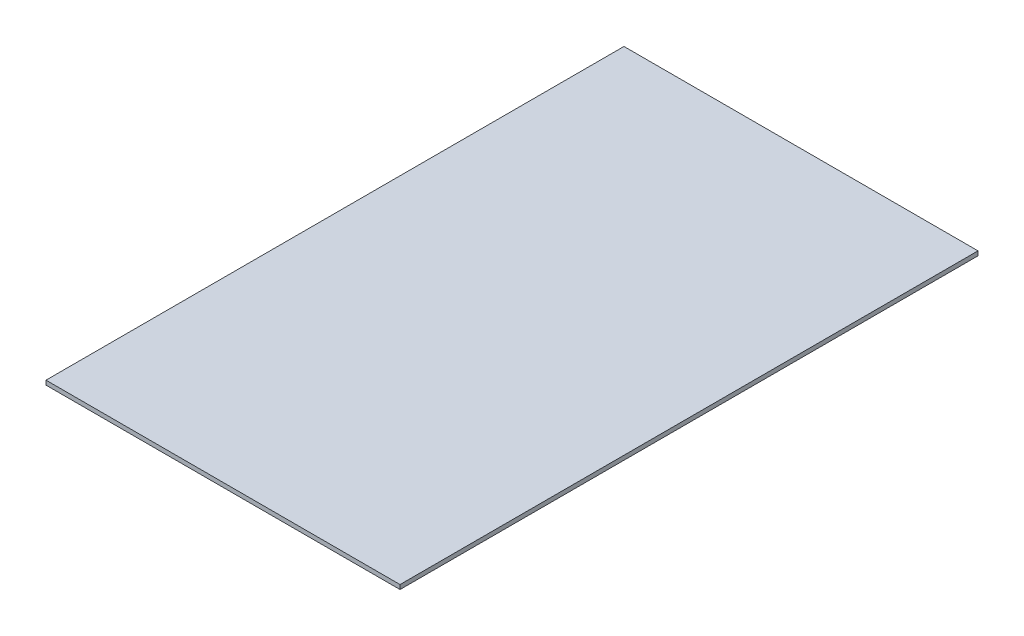
ISO-10303-21;
HEADER;
FILE_DESCRIPTION(('STEP AP214'),'2;1');
FILE_NAME('part.step','',(''),(''),'','','');
FILE_SCHEMA(('AUTOMOTIVE_DESIGN { 1 0 10303 214 1 1 1 1 }'));
ENDSEC;
DATA;
#1=APPLICATION_CONTEXT('core data for automotive mechanical design processes');
#2=APPLICATION_PROTOCOL_DEFINITION('international standard','automotive_design',2000,#1);
#3=PRODUCT_CONTEXT('',#1,'mechanical');
#4=PRODUCT('Part','Part','',(#3));
#5=PRODUCT_RELATED_PRODUCT_CATEGORY('part','',(#4));
#6=PRODUCT_DEFINITION_FORMATION('','',#4);
#7=PRODUCT_DEFINITION_CONTEXT('part definition',#1,'design');
#8=PRODUCT_DEFINITION('design','',#6,#7);
#9=PRODUCT_DEFINITION_SHAPE('','',#8);
#10=(LENGTH_UNIT() NAMED_UNIT(*) SI_UNIT(.MILLI.,.METRE.));
#11=(NAMED_UNIT(*) PLANE_ANGLE_UNIT() SI_UNIT($,.RADIAN.));
#12=(NAMED_UNIT(*) SI_UNIT($,.STERADIAN.) SOLID_ANGLE_UNIT());
#13=UNCERTAINTY_MEASURE_WITH_UNIT(LENGTH_MEASURE(1.E-05),#10,'distance_accuracy_value','');
#14=(GEOMETRIC_REPRESENTATION_CONTEXT(3) GLOBAL_UNCERTAINTY_ASSIGNED_CONTEXT((#13)) GLOBAL_UNIT_ASSIGNED_CONTEXT((#10,
#11,#12)) REPRESENTATION_CONTEXT('',''));
#15=CARTESIAN_POINT('',(0.,0.,0.));
#16=DIRECTION('',(0.,0.,1.));
#17=DIRECTION('',(1.,0.,0.));
#18=AXIS2_PLACEMENT_3D('',#15,#16,#17);
#19=CARTESIAN_POINT('',(0.,3.,0.));
#20=DIRECTION('',(1.,0.,0.));
#21=DIRECTION('',(0.,0.,-1.));
#22=AXIS2_PLACEMENT_3D('',#19,#20,#21);
#23=PLANE('',#22);
#24=DIRECTION('',(0.,0.,1.));
#25=VECTOR('',#24,1.);
#26=CARTESIAN_POINT('',(0.,0.,0.));
#27=LINE('',#26,#25);
#28=CARTESIAN_POINT('',(0.,0.,-400.));
#29=VERTEX_POINT('',#28);
#30=CARTESIAN_POINT('',(0.,0.,0.));
#31=VERTEX_POINT('',#30);
#32=EDGE_CURVE('E99',#29,#31,#27,.T.);
#33=ORIENTED_EDGE('',*,*,#32,.T.);
#34=DIRECTION('',(0.,-1.,0.));
#35=VECTOR('',#34,1.);
#36=CARTESIAN_POINT('',(0.,3.,0.));
#37=LINE('',#36,#35);
#38=CARTESIAN_POINT('',(0.,3.,0.));
#39=VERTEX_POINT('',#38);
#40=EDGE_CURVE('E11',#39,#31,#37,.T.);
#41=ORIENTED_EDGE('',*,*,#40,.F.);
#42=DIRECTION('',(0.,0.,1.));
#43=VECTOR('',#42,1.);
#44=CARTESIAN_POINT('',(0.,3.,0.));
#45=LINE('',#44,#43);
#46=CARTESIAN_POINT('',(0.,3.,-400.));
#47=VERTEX_POINT('',#46);
#48=EDGE_CURVE('E87',#47,#39,#45,.T.);
#49=ORIENTED_EDGE('',*,*,#48,.F.);
#50=DIRECTION('',(0.,-1.,0.));
#51=VECTOR('',#50,1.);
#52=CARTESIAN_POINT('',(0.,3.,-400.));
#53=LINE('',#52,#51);
#54=EDGE_CURVE('E95',#47,#29,#53,.T.);
#55=ORIENTED_EDGE('',*,*,#54,.T.);
#56=EDGE_LOOP('',(#33,#41,#49,#55));
#57=FACE_BOUND('',#56,.T.);
#58=ADVANCED_FACE('F36',(#57),#23,.F.);
#59=CARTESIAN_POINT('',(0.,3.,0.));
#60=DIRECTION('',(0.,0.,-1.));
#61=DIRECTION('',(-1.,0.,0.));
#62=AXIS2_PLACEMENT_3D('',#59,#60,#61);
#63=PLANE('',#62);
#64=DIRECTION('',(1.,0.,0.));
#65=VECTOR('',#64,1.);
#66=CARTESIAN_POINT('',(0.,0.,0.));
#67=LINE('',#66,#65);
#68=CARTESIAN_POINT('',(245.,0.,0.));
#69=VERTEX_POINT('',#68);
#70=EDGE_CURVE('E91',#31,#69,#67,.T.);
#71=ORIENTED_EDGE('',*,*,#70,.T.);
#72=DIRECTION('',(0.,-1.,0.));
#73=VECTOR('',#72,1.);
#74=CARTESIAN_POINT('',(245.,3.,0.));
#75=LINE('',#74,#73);
#76=CARTESIAN_POINT('',(245.,3.,0.));
#77=VERTEX_POINT('',#76);
#78=EDGE_CURVE('E44',#77,#69,#75,.T.);
#79=ORIENTED_EDGE('',*,*,#78,.F.);
#80=DIRECTION('',(1.,0.,0.));
#81=VECTOR('',#80,1.);
#82=CARTESIAN_POINT('',(0.,3.,0.));
#83=LINE('',#82,#81);
#84=EDGE_CURVE('E82',#39,#77,#83,.T.);
#85=ORIENTED_EDGE('',*,*,#84,.F.);
#86=ORIENTED_EDGE('',*,*,#40,.T.);
#87=EDGE_LOOP('',(#71,#79,#85,#86));
#88=FACE_BOUND('',#87,.T.);
#89=ADVANCED_FACE('F90',(#88),#63,.F.);
#90=CARTESIAN_POINT('',(245.,3.,0.));
#91=DIRECTION('',(-1.,0.,0.));
#92=DIRECTION('',(0.,0.,1.));
#93=AXIS2_PLACEMENT_3D('',#90,#91,#92);
#94=PLANE('',#93);
#95=DIRECTION('',(0.,0.,-1.));
#96=VECTOR('',#95,1.);
#97=CARTESIAN_POINT('',(245.,0.,0.));
#98=LINE('',#97,#96);
#99=CARTESIAN_POINT('',(245.,0.,-400.));
#100=VERTEX_POINT('',#99);
#101=EDGE_CURVE('E69',#69,#100,#98,.T.);
#102=ORIENTED_EDGE('',*,*,#101,.T.);
#103=DIRECTION('',(0.,-1.,0.));
#104=VECTOR('',#103,1.);
#105=CARTESIAN_POINT('',(245.,3.,-400.));
#106=LINE('',#105,#104);
#107=CARTESIAN_POINT('',(245.,3.,-400.));
#108=VERTEX_POINT('',#107);
#109=EDGE_CURVE('E92',#108,#100,#106,.T.);
#110=ORIENTED_EDGE('',*,*,#109,.F.);
#111=DIRECTION('',(0.,0.,-1.));
#112=VECTOR('',#111,1.);
#113=CARTESIAN_POINT('',(245.,3.,0.));
#114=LINE('',#113,#112);
#115=EDGE_CURVE('E85',#77,#108,#114,.T.);
#116=ORIENTED_EDGE('',*,*,#115,.F.);
#117=ORIENTED_EDGE('',*,*,#78,.T.);
#118=EDGE_LOOP('',(#102,#110,#116,#117));
#119=FACE_BOUND('',#118,.T.);
#120=ADVANCED_FACE('F93',(#119),#94,.F.);
#121=CARTESIAN_POINT('',(0.,3.,-400.));
#122=DIRECTION('',(0.,0.,1.));
#123=DIRECTION('',(1.,0.,0.));
#124=AXIS2_PLACEMENT_3D('',#121,#122,#123);
#125=PLANE('',#124);
#126=DIRECTION('',(-1.,0.,0.));
#127=VECTOR('',#126,1.);
#128=CARTESIAN_POINT('',(0.,0.,-400.));
#129=LINE('',#128,#127);
#130=EDGE_CURVE('E75',#100,#29,#129,.T.);
#131=ORIENTED_EDGE('',*,*,#130,.T.);
#132=ORIENTED_EDGE('',*,*,#54,.F.);
#133=DIRECTION('',(-1.,0.,0.));
#134=VECTOR('',#133,1.);
#135=CARTESIAN_POINT('',(0.,3.,-400.));
#136=LINE('',#135,#134);
#137=EDGE_CURVE('E52',#108,#47,#136,.T.);
#138=ORIENTED_EDGE('',*,*,#137,.F.);
#139=ORIENTED_EDGE('',*,*,#109,.T.);
#140=EDGE_LOOP('',(#131,#132,#138,#139));
#141=FACE_BOUND('',#140,.T.);
#142=ADVANCED_FACE('F106',(#141),#125,.F.);
#143=CARTESIAN_POINT('',(0.,3.,0.));
#144=DIRECTION('',(0.,-1.,0.));
#145=DIRECTION('',(0.,0.,-1.));
#146=AXIS2_PLACEMENT_3D('',#143,#144,#145);
#147=PLANE('',#146);
#148=ORIENTED_EDGE('',*,*,#48,.T.);
#149=ORIENTED_EDGE('',*,*,#84,.T.);
#150=ORIENTED_EDGE('',*,*,#115,.T.);
#151=ORIENTED_EDGE('',*,*,#137,.T.);
#152=EDGE_LOOP('',(#148,#149,#150,#151));
#153=FACE_BOUND('',#152,.T.);
#154=ADVANCED_FACE('F83',(#153),#147,.F.);
#155=CARTESIAN_POINT('',(0.,0.,0.));
#156=DIRECTION('',(0.,-1.,0.));
#157=DIRECTION('',(0.,0.,-1.));
#158=AXIS2_PLACEMENT_3D('',#155,#156,#157);
#159=PLANE('',#158);
#160=ORIENTED_EDGE('',*,*,#32,.F.);
#161=ORIENTED_EDGE('',*,*,#130,.F.);
#162=ORIENTED_EDGE('',*,*,#101,.F.);
#163=ORIENTED_EDGE('',*,*,#70,.F.);
#164=EDGE_LOOP('',(#160,#161,#162,#163));
#165=FACE_BOUND('',#164,.T.);
#166=ADVANCED_FACE('F109',(#165),#159,.T.);
#167=CLOSED_SHELL('',(#58,#89,#120,#142,#154,#166));
#168=MANIFOLD_SOLID_BREP('B2',#167);
#169=ADVANCED_BREP_SHAPE_REPRESENTATION('',(#18,#168),#14);
#170=SHAPE_DEFINITION_REPRESENTATION(#9,#169);
ENDSEC;
END-ISO-10303-21;
